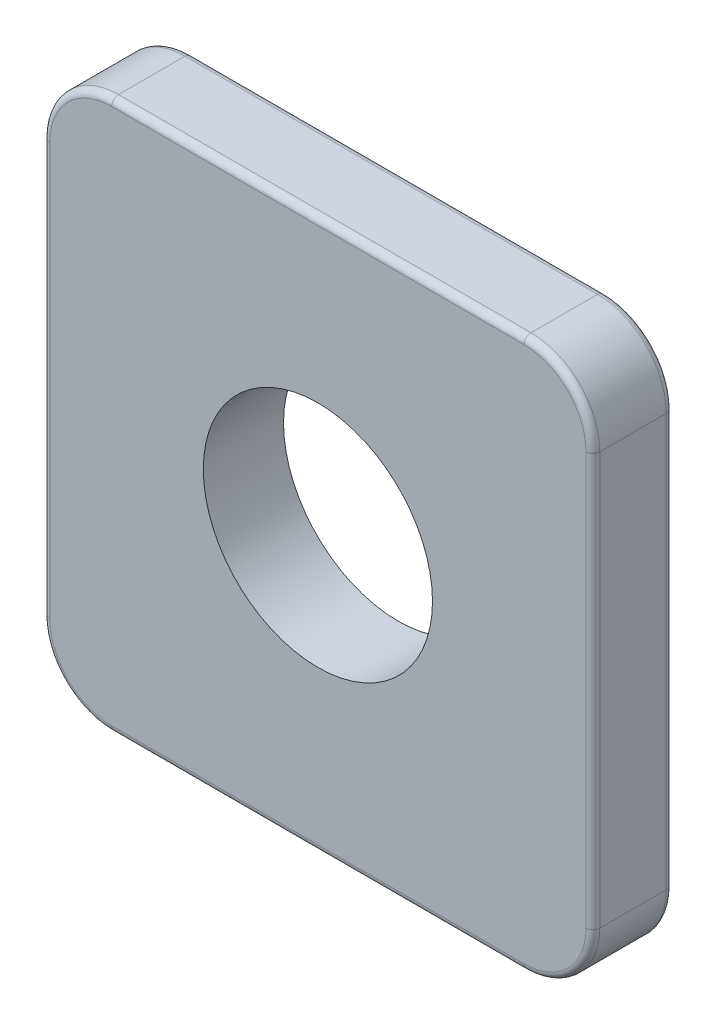
ISO-10303-21;
HEADER;
FILE_DESCRIPTION(('STEP AP214'),'2;1');
FILE_NAME('part.step','',(''),(''),'','','');
FILE_SCHEMA(('AUTOMOTIVE_DESIGN { 1 0 10303 214 1 1 1 1 }'));
ENDSEC;
DATA;
#1=APPLICATION_CONTEXT('core data for automotive mechanical design processes');
#2=APPLICATION_PROTOCOL_DEFINITION('international standard','automotive_design',2000,#1);
#3=PRODUCT_CONTEXT('',#1,'mechanical');
#4=PRODUCT('Part','Part','',(#3));
#5=PRODUCT_RELATED_PRODUCT_CATEGORY('part','',(#4));
#6=PRODUCT_DEFINITION_FORMATION('','',#4);
#7=PRODUCT_DEFINITION_CONTEXT('part definition',#1,'design');
#8=PRODUCT_DEFINITION('design','',#6,#7);
#9=PRODUCT_DEFINITION_SHAPE('','',#8);
#10=(LENGTH_UNIT() NAMED_UNIT(*) SI_UNIT(.MILLI.,.METRE.));
#11=(NAMED_UNIT(*) PLANE_ANGLE_UNIT() SI_UNIT($,.RADIAN.));
#12=(NAMED_UNIT(*) SI_UNIT($,.STERADIAN.) SOLID_ANGLE_UNIT());
#13=UNCERTAINTY_MEASURE_WITH_UNIT(LENGTH_MEASURE(1.E-05),#10,'distance_accuracy_value','');
#14=(GEOMETRIC_REPRESENTATION_CONTEXT(3) GLOBAL_UNCERTAINTY_ASSIGNED_CONTEXT((#13)) GLOBAL_UNIT_ASSIGNED_CONTEXT((#10,
#11,#12)) REPRESENTATION_CONTEXT('',''));
#15=CARTESIAN_POINT('',(0.,0.,0.));
#16=DIRECTION('',(0.,0.,1.));
#17=DIRECTION('',(1.,0.,0.));
#18=AXIS2_PLACEMENT_3D('',#15,#16,#17);
#19=CARTESIAN_POINT('',(9.,-9.,1.75));
#20=DIRECTION('',(0.,0.,1.));
#21=DIRECTION('',(1.,0.,0.));
#22=AXIS2_PLACEMENT_3D('',#19,#20,#21);
#23=PLANE('',#22);
#24=DIRECTION('',(1.,0.,0.));
#25=VECTOR('',#24,1.);
#26=CARTESIAN_POINT('',(8.99999999999998,-11.7,1.75));
#27=LINE('',#26,#25);
#28=CARTESIAN_POINT('',(-8.99999999999998,-11.7,1.75));
#29=VERTEX_POINT('',#28);
#30=CARTESIAN_POINT('',(8.99999999999998,-11.7,1.75));
#31=VERTEX_POINT('',#30);
#32=EDGE_CURVE('E60',#29,#31,#27,.T.);
#33=ORIENTED_EDGE('',*,*,#32,.T.);
#34=CARTESIAN_POINT('',(9.,-9.,1.75));
#35=DIRECTION('',(0.,0.,1.));
#36=DIRECTION('',(1.,0.,0.));
#37=AXIS2_PLACEMENT_3D('',#34,#35,#36);
#38=CIRCLE('',#37,2.7);
#39=CARTESIAN_POINT('',(11.7,-8.99999999999998,1.75));
#40=VERTEX_POINT('',#39);
#41=EDGE_CURVE('E167',#31,#40,#38,.T.);
#42=ORIENTED_EDGE('',*,*,#41,.T.);
#43=DIRECTION('',(0.,1.,0.));
#44=VECTOR('',#43,1.);
#45=CARTESIAN_POINT('',(11.7,8.99999999999998,1.75));
#46=LINE('',#45,#44);
#47=CARTESIAN_POINT('',(11.7,8.99999999999999,1.75));
#48=VERTEX_POINT('',#47);
#49=EDGE_CURVE('E189',#40,#48,#46,.T.);
#50=ORIENTED_EDGE('',*,*,#49,.T.);
#51=CARTESIAN_POINT('',(9.,9.00000000000001,1.75));
#52=DIRECTION('',(0.,0.,1.));
#53=DIRECTION('',(1.,0.,0.));
#54=AXIS2_PLACEMENT_3D('',#51,#52,#53);
#55=CIRCLE('',#54,2.7);
#56=CARTESIAN_POINT('',(8.99999999999998,11.7,1.75));
#57=VERTEX_POINT('',#56);
#58=EDGE_CURVE('E318',#48,#57,#55,.T.);
#59=ORIENTED_EDGE('',*,*,#58,.T.);
#60=DIRECTION('',(-1.,0.,0.));
#61=VECTOR('',#60,1.);
#62=CARTESIAN_POINT('',(-8.99999999999998,11.7,1.75));
#63=LINE('',#62,#61);
#64=CARTESIAN_POINT('',(-8.99999999999998,11.7,1.75));
#65=VERTEX_POINT('',#64);
#66=EDGE_CURVE('E320',#57,#65,#63,.T.);
#67=ORIENTED_EDGE('',*,*,#66,.T.);
#68=CARTESIAN_POINT('',(-9.00000000000001,9.,1.75));
#69=DIRECTION('',(0.,0.,1.));
#70=DIRECTION('',(1.,0.,0.));
#71=AXIS2_PLACEMENT_3D('',#68,#69,#70);
#72=CIRCLE('',#71,2.7);
#73=CARTESIAN_POINT('',(-11.7,8.99999999999998,1.75));
#74=VERTEX_POINT('',#73);
#75=EDGE_CURVE('E322',#65,#74,#72,.T.);
#76=ORIENTED_EDGE('',*,*,#75,.T.);
#77=DIRECTION('',(0.,-1.,0.));
#78=VECTOR('',#77,1.);
#79=CARTESIAN_POINT('',(-11.7,-9.,1.75));
#80=LINE('',#79,#78);
#81=CARTESIAN_POINT('',(-11.7,-9.,1.75));
#82=VERTEX_POINT('',#81);
#83=EDGE_CURVE('E324',#74,#82,#80,.T.);
#84=ORIENTED_EDGE('',*,*,#83,.T.);
#85=CARTESIAN_POINT('',(-9.00000000000001,-9.,1.75));
#86=DIRECTION('',(0.,0.,1.));
#87=DIRECTION('',(1.,0.,0.));
#88=AXIS2_PLACEMENT_3D('',#85,#86,#87);
#89=CIRCLE('',#88,2.7);
#90=EDGE_CURVE('E65',#82,#29,#89,.T.);
#91=ORIENTED_EDGE('',*,*,#90,.T.);
#92=EDGE_LOOP('',(#33,#42,#50,#59,#67,#76,#84,#91));
#93=FACE_BOUND('',#92,.T.);
#94=CARTESIAN_POINT('',(0.,0.,1.75));
#95=DIRECTION('',(0.,0.,1.));
#96=DIRECTION('',(1.,0.,0.));
#97=AXIS2_PLACEMENT_3D('',#94,#95,#96);
#98=CIRCLE('',#97,5.);
#99=CARTESIAN_POINT('',(5.,0.,1.75));
#100=VERTEX_POINT('',#99);
#101=EDGE_CURVE('E250',#100,#100,#98,.T.);
#102=ORIENTED_EDGE('',*,*,#101,.F.);
#103=EDGE_LOOP('',(#102));
#104=FACE_BOUND('',#103,.T.);
#105=ADVANCED_FACE('F43',(#93,#104),#23,.T.);
#106=CARTESIAN_POINT('',(9.,-9.,-1.75));
#107=DIRECTION('',(0.,0.,1.));
#108=DIRECTION('',(1.,0.,0.));
#109=AXIS2_PLACEMENT_3D('',#106,#107,#108);
#110=PLANE('',#109);
#111=DIRECTION('',(0.,1.,0.));
#112=VECTOR('',#111,1.);
#113=CARTESIAN_POINT('',(11.7,-9.,-1.75));
#114=LINE('',#113,#112);
#115=CARTESIAN_POINT('',(11.7,8.99999999999999,-1.75));
#116=VERTEX_POINT('',#115);
#117=CARTESIAN_POINT('',(11.7,-8.99999999999998,-1.75));
#118=VERTEX_POINT('',#117);
#119=EDGE_CURVE('E276',#116,#118,#114,.F.);
#120=ORIENTED_EDGE('',*,*,#119,.T.);
#121=CARTESIAN_POINT('',(9.,-9.,-1.75));
#122=DIRECTION('',(0.,0.,1.));
#123=DIRECTION('',(1.,0.,0.));
#124=AXIS2_PLACEMENT_3D('',#121,#122,#123);
#125=CIRCLE('',#124,2.7);
#126=CARTESIAN_POINT('',(8.99999999999998,-11.7,-1.75));
#127=VERTEX_POINT('',#126);
#128=EDGE_CURVE('E290',#118,#127,#125,.F.);
#129=ORIENTED_EDGE('',*,*,#128,.T.);
#130=DIRECTION('',(1.,0.,0.));
#131=VECTOR('',#130,1.);
#132=CARTESIAN_POINT('',(9.,-11.7,-1.75));
#133=LINE('',#132,#131);
#134=CARTESIAN_POINT('',(-8.99999999999998,-11.7,-1.75));
#135=VERTEX_POINT('',#134);
#136=EDGE_CURVE('E288',#127,#135,#133,.F.);
#137=ORIENTED_EDGE('',*,*,#136,.T.);
#138=CARTESIAN_POINT('',(-9.00000000000001,-9.,-1.75));
#139=DIRECTION('',(0.,0.,1.));
#140=DIRECTION('',(1.,0.,0.));
#141=AXIS2_PLACEMENT_3D('',#138,#139,#140);
#142=CIRCLE('',#141,2.7);
#143=CARTESIAN_POINT('',(-11.7,-9.,-1.75));
#144=VERTEX_POINT('',#143);
#145=EDGE_CURVE('E286',#135,#144,#142,.F.);
#146=ORIENTED_EDGE('',*,*,#145,.T.);
#147=DIRECTION('',(0.,-1.,0.));
#148=VECTOR('',#147,1.);
#149=CARTESIAN_POINT('',(-11.7,-9.,-1.75));
#150=LINE('',#149,#148);
#151=CARTESIAN_POINT('',(-11.7,8.99999999999998,-1.75));
#152=VERTEX_POINT('',#151);
#153=EDGE_CURVE('E284',#144,#152,#150,.F.);
#154=ORIENTED_EDGE('',*,*,#153,.T.);
#155=CARTESIAN_POINT('',(-9.00000000000001,9.,-1.75));
#156=DIRECTION('',(0.,0.,1.));
#157=DIRECTION('',(1.,0.,0.));
#158=AXIS2_PLACEMENT_3D('',#155,#156,#157);
#159=CIRCLE('',#158,2.7);
#160=CARTESIAN_POINT('',(-8.99999999999998,11.7,-1.75));
#161=VERTEX_POINT('',#160);
#162=EDGE_CURVE('E282',#152,#161,#159,.F.);
#163=ORIENTED_EDGE('',*,*,#162,.T.);
#164=DIRECTION('',(-1.,0.,0.));
#165=VECTOR('',#164,1.);
#166=CARTESIAN_POINT('',(8.99999999999999,11.7,-1.75));
#167=LINE('',#166,#165);
#168=CARTESIAN_POINT('',(8.99999999999998,11.7,-1.75));
#169=VERTEX_POINT('',#168);
#170=EDGE_CURVE('E280',#161,#169,#167,.F.);
#171=ORIENTED_EDGE('',*,*,#170,.T.);
#172=CARTESIAN_POINT('',(9.,9.00000000000001,-1.75));
#173=DIRECTION('',(0.,0.,1.));
#174=DIRECTION('',(1.,0.,0.));
#175=AXIS2_PLACEMENT_3D('',#172,#173,#174);
#176=CIRCLE('',#175,2.7);
#177=EDGE_CURVE('E278',#169,#116,#176,.F.);
#178=ORIENTED_EDGE('',*,*,#177,.T.);
#179=EDGE_LOOP('',(#120,#129,#137,#146,#154,#163,#171,#178));
#180=FACE_BOUND('',#179,.T.);
#181=CARTESIAN_POINT('',(0.,0.,-1.75));
#182=DIRECTION('',(0.,0.,1.));
#183=DIRECTION('',(1.,0.,0.));
#184=AXIS2_PLACEMENT_3D('',#181,#182,#183);
#185=CIRCLE('',#184,5.);
#186=CARTESIAN_POINT('',(5.,0.,-1.75));
#187=VERTEX_POINT('',#186);
#188=EDGE_CURVE('E244',#187,#187,#185,.T.);
#189=ORIENTED_EDGE('',*,*,#188,.T.);
#190=EDGE_LOOP('',(#189));
#191=FACE_BOUND('',#190,.T.);
#192=ADVANCED_FACE('F374',(#180,#191),#110,.F.);
#193=CARTESIAN_POINT('',(9.,-9.,1.75));
#194=DIRECTION('',(0.,0.,-1.));
#195=DIRECTION('',(-1.,0.,0.));
#196=AXIS2_PLACEMENT_3D('',#193,#194,#195);
#197=CYLINDRICAL_SURFACE('',#196,3.);
#198=DIRECTION('',(0.,0.,-1.));
#199=VECTOR('',#198,1.);
#200=CARTESIAN_POINT('',(8.99999999999998,-12.,1.75));
#201=LINE('',#200,#199);
#202=CARTESIAN_POINT('',(8.99999999999998,-12.,1.45));
#203=VERTEX_POINT('',#202);
#204=CARTESIAN_POINT('',(8.99999999999998,-12.,-1.45));
#205=VERTEX_POINT('',#204);
#206=EDGE_CURVE('E255',#203,#205,#201,.T.);
#207=ORIENTED_EDGE('',*,*,#206,.T.);
#208=CARTESIAN_POINT('',(9.,-9.,-1.45));
#209=DIRECTION('',(0.,0.,1.));
#210=DIRECTION('',(1.,0.,0.));
#211=AXIS2_PLACEMENT_3D('',#208,#209,#210);
#212=CIRCLE('',#211,3.);
#213=CARTESIAN_POINT('',(12.,-8.99999999999998,-1.45));
#214=VERTEX_POINT('',#213);
#215=EDGE_CURVE('E178',#205,#214,#212,.T.);
#216=ORIENTED_EDGE('',*,*,#215,.T.);
#217=DIRECTION('',(0.,0.,-1.));
#218=VECTOR('',#217,1.);
#219=CARTESIAN_POINT('',(12.,-8.99999999999998,1.75));
#220=LINE('',#219,#218);
#221=CARTESIAN_POINT('',(12.,-8.99999999999998,1.45));
#222=VERTEX_POINT('',#221);
#223=EDGE_CURVE('E160',#222,#214,#220,.T.);
#224=ORIENTED_EDGE('',*,*,#223,.F.);
#225=CARTESIAN_POINT('',(9.,-9.,1.45));
#226=DIRECTION('',(0.,0.,1.));
#227=DIRECTION('',(1.,0.,0.));
#228=AXIS2_PLACEMENT_3D('',#225,#226,#227);
#229=CIRCLE('',#228,3.);
#230=EDGE_CURVE('E175',#222,#203,#229,.F.);
#231=ORIENTED_EDGE('',*,*,#230,.T.);
#232=EDGE_LOOP('',(#207,#216,#224,#231));
#233=FACE_BOUND('',#232,.T.);
#234=ADVANCED_FACE('F174',(#233),#197,.T.);
#235=CARTESIAN_POINT('',(12.,-8.99999999999998,1.75));
#236=DIRECTION('',(-1.,0.,0.));
#237=DIRECTION('',(0.,0.,1.));
#238=AXIS2_PLACEMENT_3D('',#235,#236,#237);
#239=PLANE('',#238);
#240=ORIENTED_EDGE('',*,*,#223,.T.);
#241=DIRECTION('',(0.,1.,0.));
#242=VECTOR('',#241,1.);
#243=CARTESIAN_POINT('',(12.,-8.99999999999998,-1.45));
#244=LINE('',#243,#242);
#245=CARTESIAN_POINT('',(12.,8.99999999999998,-1.45));
#246=VERTEX_POINT('',#245);
#247=EDGE_CURVE('E11',#214,#246,#244,.T.);
#248=ORIENTED_EDGE('',*,*,#247,.T.);
#249=DIRECTION('',(0.,0.,-1.));
#250=VECTOR('',#249,1.);
#251=CARTESIAN_POINT('',(12.,8.99999999999998,1.75));
#252=LINE('',#251,#250);
#253=CARTESIAN_POINT('',(12.,8.99999999999998,1.45));
#254=VERTEX_POINT('',#253);
#255=EDGE_CURVE('E162',#254,#246,#252,.T.);
#256=ORIENTED_EDGE('',*,*,#255,.F.);
#257=DIRECTION('',(0.,1.,0.));
#258=VECTOR('',#257,1.);
#259=CARTESIAN_POINT('',(12.,-8.99999999999998,1.45));
#260=LINE('',#259,#258);
#261=EDGE_CURVE('E52',#254,#222,#260,.F.);
#262=ORIENTED_EDGE('',*,*,#261,.T.);
#263=EDGE_LOOP('',(#240,#248,#256,#262));
#264=FACE_BOUND('',#263,.T.);
#265=ADVANCED_FACE('F159',(#264),#239,.F.);
#266=CARTESIAN_POINT('',(9.,9.00000000000001,1.75));
#267=DIRECTION('',(0.,0.,-1.));
#268=DIRECTION('',(-1.,0.,0.));
#269=AXIS2_PLACEMENT_3D('',#266,#267,#268);
#270=CYLINDRICAL_SURFACE('',#269,3.);
#271=ORIENTED_EDGE('',*,*,#255,.T.);
#272=CARTESIAN_POINT('',(9.,9.00000000000001,-1.45));
#273=DIRECTION('',(0.,0.,1.));
#274=DIRECTION('',(1.,0.,0.));
#275=AXIS2_PLACEMENT_3D('',#272,#273,#274);
#276=CIRCLE('',#275,3.);
#277=CARTESIAN_POINT('',(8.99999999999998,12.,-1.45));
#278=VERTEX_POINT('',#277);
#279=EDGE_CURVE('E315',#246,#278,#276,.T.);
#280=ORIENTED_EDGE('',*,*,#279,.T.);
#281=DIRECTION('',(0.,0.,-1.));
#282=VECTOR('',#281,1.);
#283=CARTESIAN_POINT('',(8.99999999999998,12.,1.75));
#284=LINE('',#283,#282);
#285=CARTESIAN_POINT('',(8.99999999999998,12.,1.45));
#286=VERTEX_POINT('',#285);
#287=EDGE_CURVE('E271',#286,#278,#284,.T.);
#288=ORIENTED_EDGE('',*,*,#287,.F.);
#289=CARTESIAN_POINT('',(9.,9.00000000000001,1.45));
#290=DIRECTION('',(0.,0.,1.));
#291=DIRECTION('',(1.,0.,0.));
#292=AXIS2_PLACEMENT_3D('',#289,#290,#291);
#293=CIRCLE('',#292,3.);
#294=EDGE_CURVE('E313',#286,#254,#293,.F.);
#295=ORIENTED_EDGE('',*,*,#294,.T.);
#296=EDGE_LOOP('',(#271,#280,#288,#295));
#297=FACE_BOUND('',#296,.T.);
#298=ADVANCED_FACE('F400',(#297),#270,.T.);
#299=CARTESIAN_POINT('',(8.99999999999998,12.,1.75));
#300=DIRECTION('',(0.,-1.,0.));
#301=DIRECTION('',(1.,0.,0.));
#302=AXIS2_PLACEMENT_3D('',#299,#300,#301);
#303=PLANE('',#302);
#304=ORIENTED_EDGE('',*,*,#287,.T.);
#305=DIRECTION('',(-1.,0.,0.));
#306=VECTOR('',#305,1.);
#307=CARTESIAN_POINT('',(8.99999999999998,12.,-1.45));
#308=LINE('',#307,#306);
#309=CARTESIAN_POINT('',(-8.99999999999998,12.,-1.45));
#310=VERTEX_POINT('',#309);
#311=EDGE_CURVE('E311',#278,#310,#308,.T.);
#312=ORIENTED_EDGE('',*,*,#311,.T.);
#313=DIRECTION('',(0.,0.,-1.));
#314=VECTOR('',#313,1.);
#315=CARTESIAN_POINT('',(-8.99999999999998,12.,1.75));
#316=LINE('',#315,#314);
#317=CARTESIAN_POINT('',(-8.99999999999998,12.,1.45));
#318=VERTEX_POINT('',#317);
#319=EDGE_CURVE('E268',#318,#310,#316,.T.);
#320=ORIENTED_EDGE('',*,*,#319,.F.);
#321=DIRECTION('',(-1.,0.,0.));
#322=VECTOR('',#321,1.);
#323=CARTESIAN_POINT('',(8.99999999999998,12.,1.45));
#324=LINE('',#323,#322);
#325=EDGE_CURVE('E309',#318,#286,#324,.F.);
#326=ORIENTED_EDGE('',*,*,#325,.T.);
#327=EDGE_LOOP('',(#304,#312,#320,#326));
#328=FACE_BOUND('',#327,.T.);
#329=ADVANCED_FACE('F396',(#328),#303,.F.);
#330=CARTESIAN_POINT('',(-9.00000000000001,9.,1.75));
#331=DIRECTION('',(0.,0.,-1.));
#332=DIRECTION('',(-1.,0.,0.));
#333=AXIS2_PLACEMENT_3D('',#330,#331,#332);
#334=CYLINDRICAL_SURFACE('',#333,3.);
#335=ORIENTED_EDGE('',*,*,#319,.T.);
#336=CARTESIAN_POINT('',(-9.00000000000001,9.,-1.45));
#337=DIRECTION('',(0.,0.,1.));
#338=DIRECTION('',(1.,0.,0.));
#339=AXIS2_PLACEMENT_3D('',#336,#337,#338);
#340=CIRCLE('',#339,3.);
#341=CARTESIAN_POINT('',(-12.,8.99999999999998,-1.45));
#342=VERTEX_POINT('',#341);
#343=EDGE_CURVE('E307',#310,#342,#340,.T.);
#344=ORIENTED_EDGE('',*,*,#343,.T.);
#345=DIRECTION('',(0.,0.,-1.));
#346=VECTOR('',#345,1.);
#347=CARTESIAN_POINT('',(-12.,8.99999999999998,1.75));
#348=LINE('',#347,#346);
#349=CARTESIAN_POINT('',(-12.,8.99999999999998,1.45));
#350=VERTEX_POINT('',#349);
#351=EDGE_CURVE('E265',#350,#342,#348,.T.);
#352=ORIENTED_EDGE('',*,*,#351,.F.);
#353=CARTESIAN_POINT('',(-9.00000000000001,9.,1.45));
#354=DIRECTION('',(0.,0.,1.));
#355=DIRECTION('',(1.,0.,0.));
#356=AXIS2_PLACEMENT_3D('',#353,#354,#355);
#357=CIRCLE('',#356,3.);
#358=EDGE_CURVE('E305',#350,#318,#357,.F.);
#359=ORIENTED_EDGE('',*,*,#358,.T.);
#360=EDGE_LOOP('',(#335,#344,#352,#359));
#361=FACE_BOUND('',#360,.T.);
#362=ADVANCED_FACE('F392',(#361),#334,.T.);
#363=CARTESIAN_POINT('',(-12.,-8.99999999999998,1.75));
#364=DIRECTION('',(1.,0.,0.));
#365=DIRECTION('',(0.,0.,-1.));
#366=AXIS2_PLACEMENT_3D('',#363,#364,#365);
#367=PLANE('',#366);
#368=ORIENTED_EDGE('',*,*,#351,.T.);
#369=DIRECTION('',(0.,-1.,0.));
#370=VECTOR('',#369,1.);
#371=CARTESIAN_POINT('',(-12.,-8.99999999999998,-1.45));
#372=LINE('',#371,#370);
#373=CARTESIAN_POINT('',(-12.,-9.,-1.45));
#374=VERTEX_POINT('',#373);
#375=EDGE_CURVE('E303',#342,#374,#372,.T.);
#376=ORIENTED_EDGE('',*,*,#375,.T.);
#377=DIRECTION('',(0.,0.,-1.));
#378=VECTOR('',#377,1.);
#379=CARTESIAN_POINT('',(-12.,-9.,1.75));
#380=LINE('',#379,#378);
#381=CARTESIAN_POINT('',(-12.,-9.,1.45));
#382=VERTEX_POINT('',#381);
#383=EDGE_CURVE('E262',#382,#374,#380,.T.);
#384=ORIENTED_EDGE('',*,*,#383,.F.);
#385=DIRECTION('',(0.,-1.,0.));
#386=VECTOR('',#385,1.);
#387=CARTESIAN_POINT('',(-12.,8.99999999999998,1.45));
#388=LINE('',#387,#386);
#389=EDGE_CURVE('E301',#382,#350,#388,.F.);
#390=ORIENTED_EDGE('',*,*,#389,.T.);
#391=EDGE_LOOP('',(#368,#376,#384,#390));
#392=FACE_BOUND('',#391,.T.);
#393=ADVANCED_FACE('F389',(#392),#367,.F.);
#394=CARTESIAN_POINT('',(-9.00000000000001,-9.,1.75));
#395=DIRECTION('',(0.,0.,-1.));
#396=DIRECTION('',(-1.,0.,0.));
#397=AXIS2_PLACEMENT_3D('',#394,#395,#396);
#398=CYLINDRICAL_SURFACE('',#397,3.);
#399=ORIENTED_EDGE('',*,*,#383,.T.);
#400=CARTESIAN_POINT('',(-9.00000000000001,-9.,-1.45));
#401=DIRECTION('',(0.,0.,1.));
#402=DIRECTION('',(1.,0.,0.));
#403=AXIS2_PLACEMENT_3D('',#400,#401,#402);
#404=CIRCLE('',#403,3.);
#405=CARTESIAN_POINT('',(-8.99999999999998,-12.,-1.45));
#406=VERTEX_POINT('',#405);
#407=EDGE_CURVE('E299',#374,#406,#404,.T.);
#408=ORIENTED_EDGE('',*,*,#407,.T.);
#409=DIRECTION('',(0.,0.,-1.));
#410=VECTOR('',#409,1.);
#411=CARTESIAN_POINT('',(-8.99999999999998,-12.,1.75));
#412=LINE('',#411,#410);
#413=CARTESIAN_POINT('',(-8.99999999999998,-12.,1.45));
#414=VERTEX_POINT('',#413);
#415=EDGE_CURVE('E259',#414,#406,#412,.T.);
#416=ORIENTED_EDGE('',*,*,#415,.F.);
#417=CARTESIAN_POINT('',(-9.00000000000001,-9.,1.45));
#418=DIRECTION('',(0.,0.,1.));
#419=DIRECTION('',(1.,0.,0.));
#420=AXIS2_PLACEMENT_3D('',#417,#418,#419);
#421=CIRCLE('',#420,3.);
#422=EDGE_CURVE('E297',#414,#382,#421,.F.);
#423=ORIENTED_EDGE('',*,*,#422,.T.);
#424=EDGE_LOOP('',(#399,#408,#416,#423));
#425=FACE_BOUND('',#424,.T.);
#426=ADVANCED_FACE('F350',(#425),#398,.T.);
#427=CARTESIAN_POINT('',(8.99999999999998,-12.,1.75));
#428=DIRECTION('',(0.,1.,0.));
#429=DIRECTION('',(-1.,0.,0.));
#430=AXIS2_PLACEMENT_3D('',#427,#428,#429);
#431=PLANE('',#430);
#432=ORIENTED_EDGE('',*,*,#415,.T.);
#433=DIRECTION('',(1.,0.,0.));
#434=VECTOR('',#433,1.);
#435=CARTESIAN_POINT('',(8.99999999999998,-12.,-1.45));
#436=LINE('',#435,#434);
#437=EDGE_CURVE('E295',#406,#205,#436,.T.);
#438=ORIENTED_EDGE('',*,*,#437,.T.);
#439=ORIENTED_EDGE('',*,*,#206,.F.);
#440=DIRECTION('',(1.,0.,0.));
#441=VECTOR('',#440,1.);
#442=CARTESIAN_POINT('',(-8.99999999999998,-12.,1.45));
#443=LINE('',#442,#441);
#444=EDGE_CURVE('E293',#203,#414,#443,.F.);
#445=ORIENTED_EDGE('',*,*,#444,.T.);
#446=EDGE_LOOP('',(#432,#438,#439,#445));
#447=FACE_BOUND('',#446,.T.);
#448=ADVANCED_FACE('F347',(#447),#431,.F.);
#449=CARTESIAN_POINT('',(0.,0.,1.75));
#450=DIRECTION('',(0.,0.,-1.));
#451=DIRECTION('',(-1.,0.,0.));
#452=AXIS2_PLACEMENT_3D('',#449,#450,#451);
#453=CYLINDRICAL_SURFACE('',#452,5.);
#454=ORIENTED_EDGE('',*,*,#101,.T.);
#455=EDGE_LOOP('',(#454));
#456=FACE_BOUND('',#455,.T.);
#457=ORIENTED_EDGE('',*,*,#188,.F.);
#458=EDGE_LOOP('',(#457));
#459=FACE_BOUND('',#458,.T.);
#460=ADVANCED_FACE('F383',(#456,#459),#453,.F.);
#461=CARTESIAN_POINT('',(-9.00000000000001,9.,-1.45));
#462=DIRECTION('',(0.,0.,1.));
#463=DIRECTION('',(1.,0.,0.));
#464=AXIS2_PLACEMENT_3D('',#461,#462,#463);
#465=TOROIDAL_SURFACE('',#464,2.7,0.3);
#466=CARTESIAN_POINT('',(-8.99999999999998,11.7,-1.45));
#467=DIRECTION('',(1.,0.,0.));
#468=DIRECTION('',(0.,1.,0.));
#469=AXIS2_PLACEMENT_3D('',#466,#467,#468);
#470=CIRCLE('',#469,0.3);
#471=EDGE_CURVE('E237',#161,#310,#470,.T.);
#472=ORIENTED_EDGE('',*,*,#471,.F.);
#473=ORIENTED_EDGE('',*,*,#162,.F.);
#474=CARTESIAN_POINT('',(-11.7,8.99999999999998,-1.45));
#475=DIRECTION('',(0.,-1.,0.));
#476=DIRECTION('',(0.,0.,-1.));
#477=AXIS2_PLACEMENT_3D('',#474,#475,#476);
#478=CIRCLE('',#477,0.3);
#479=EDGE_CURVE('E194',#342,#152,#478,.T.);
#480=ORIENTED_EDGE('',*,*,#479,.F.);
#481=ORIENTED_EDGE('',*,*,#343,.F.);
#482=EDGE_LOOP('',(#472,#473,#480,#481));
#483=FACE_BOUND('',#482,.T.);
#484=ADVANCED_FACE('F443',(#483),#465,.T.);
#485=CARTESIAN_POINT('',(-11.7,-8.99999999999998,-1.45));
#486=DIRECTION('',(0.,-1.,0.));
#487=DIRECTION('',(0.,0.,-1.));
#488=AXIS2_PLACEMENT_3D('',#485,#486,#487);
#489=CYLINDRICAL_SURFACE('',#488,0.3);
#490=ORIENTED_EDGE('',*,*,#479,.T.);
#491=ORIENTED_EDGE('',*,*,#153,.F.);
#492=CARTESIAN_POINT('',(-11.7,-9.,-1.45));
#493=DIRECTION('',(0.,-1.,0.));
#494=DIRECTION('',(0.,0.,-1.));
#495=AXIS2_PLACEMENT_3D('',#492,#493,#494);
#496=CIRCLE('',#495,0.3);
#497=EDGE_CURVE('E235',#374,#144,#496,.T.);
#498=ORIENTED_EDGE('',*,*,#497,.F.);
#499=ORIENTED_EDGE('',*,*,#375,.F.);
#500=EDGE_LOOP('',(#490,#491,#498,#499));
#501=FACE_BOUND('',#500,.T.);
#502=ADVANCED_FACE('F448',(#501),#489,.T.);
#503=CARTESIAN_POINT('',(8.99999999999998,11.7,-1.45));
#504=DIRECTION('',(-1.,0.,0.));
#505=DIRECTION('',(0.,-1.,0.));
#506=AXIS2_PLACEMENT_3D('',#503,#504,#505);
#507=CYLINDRICAL_SURFACE('',#506,0.3);
#508=ORIENTED_EDGE('',*,*,#471,.T.);
#509=ORIENTED_EDGE('',*,*,#311,.F.);
#510=CARTESIAN_POINT('',(8.99999999999998,11.7,-1.45));
#511=DIRECTION('',(1.,0.,0.));
#512=DIRECTION('',(0.,0.,-1.));
#513=AXIS2_PLACEMENT_3D('',#510,#511,#512);
#514=CIRCLE('',#513,0.3);
#515=EDGE_CURVE('E232',#169,#278,#514,.T.);
#516=ORIENTED_EDGE('',*,*,#515,.F.);
#517=ORIENTED_EDGE('',*,*,#170,.F.);
#518=EDGE_LOOP('',(#508,#509,#516,#517));
#519=FACE_BOUND('',#518,.T.);
#520=ADVANCED_FACE('F460',(#519),#507,.T.);
#521=CARTESIAN_POINT('',(-9.00000000000001,-9.,-1.45));
#522=DIRECTION('',(0.,0.,1.));
#523=DIRECTION('',(1.,0.,0.));
#524=AXIS2_PLACEMENT_3D('',#521,#522,#523);
#525=TOROIDAL_SURFACE('',#524,2.7,0.3);
#526=ORIENTED_EDGE('',*,*,#497,.T.);
#527=ORIENTED_EDGE('',*,*,#145,.F.);
#528=CARTESIAN_POINT('',(-8.99999999999998,-11.7,-1.45));
#529=DIRECTION('',(1.,0.,0.));
#530=DIRECTION('',(0.,0.,-1.));
#531=AXIS2_PLACEMENT_3D('',#528,#529,#530);
#532=CIRCLE('',#531,0.3);
#533=EDGE_CURVE('E229',#406,#135,#532,.T.);
#534=ORIENTED_EDGE('',*,*,#533,.F.);
#535=ORIENTED_EDGE('',*,*,#407,.F.);
#536=EDGE_LOOP('',(#526,#527,#534,#535));
#537=FACE_BOUND('',#536,.T.);
#538=ADVANCED_FACE('F355',(#537),#525,.T.);
#539=CARTESIAN_POINT('',(9.,9.00000000000001,-1.45));
#540=DIRECTION('',(0.,0.,1.));
#541=DIRECTION('',(1.,0.,0.));
#542=AXIS2_PLACEMENT_3D('',#539,#540,#541);
#543=TOROIDAL_SURFACE('',#542,2.7,0.3);
#544=ORIENTED_EDGE('',*,*,#515,.T.);
#545=ORIENTED_EDGE('',*,*,#279,.F.);
#546=CARTESIAN_POINT('',(11.7,8.99999999999999,-1.45));
#547=DIRECTION('',(0.,-1.,0.));
#548=DIRECTION('',(1.,0.,0.));
#549=AXIS2_PLACEMENT_3D('',#546,#547,#548);
#550=CIRCLE('',#549,0.3);
#551=EDGE_CURVE('E224',#116,#246,#550,.T.);
#552=ORIENTED_EDGE('',*,*,#551,.F.);
#553=ORIENTED_EDGE('',*,*,#177,.F.);
#554=EDGE_LOOP('',(#544,#545,#552,#553));
#555=FACE_BOUND('',#554,.T.);
#556=ADVANCED_FACE('F479',(#555),#543,.T.);
#557=CARTESIAN_POINT('',(8.99999999999998,-11.7,-1.45));
#558=DIRECTION('',(1.,0.,0.));
#559=DIRECTION('',(0.,1.,0.));
#560=AXIS2_PLACEMENT_3D('',#557,#558,#559);
#561=CYLINDRICAL_SURFACE('',#560,0.3);
#562=ORIENTED_EDGE('',*,*,#533,.T.);
#563=ORIENTED_EDGE('',*,*,#136,.F.);
#564=CARTESIAN_POINT('',(8.99999999999998,-11.7,-1.45));
#565=DIRECTION('',(1.,0.,0.));
#566=DIRECTION('',(0.,0.,-1.));
#567=AXIS2_PLACEMENT_3D('',#564,#565,#566);
#568=CIRCLE('',#567,0.3);
#569=EDGE_CURVE('E218',#205,#127,#568,.T.);
#570=ORIENTED_EDGE('',*,*,#569,.F.);
#571=ORIENTED_EDGE('',*,*,#437,.F.);
#572=EDGE_LOOP('',(#562,#563,#570,#571));
#573=FACE_BOUND('',#572,.T.);
#574=ADVANCED_FACE('F361',(#573),#561,.T.);
#575=CARTESIAN_POINT('',(11.7,-8.99999999999998,-1.45));
#576=DIRECTION('',(0.,1.,0.));
#577=DIRECTION('',(0.,0.,1.));
#578=AXIS2_PLACEMENT_3D('',#575,#576,#577);
#579=CYLINDRICAL_SURFACE('',#578,0.3);
#580=ORIENTED_EDGE('',*,*,#551,.T.);
#581=ORIENTED_EDGE('',*,*,#247,.F.);
#582=CARTESIAN_POINT('',(11.7,-8.99999999999998,-1.45));
#583=DIRECTION('',(0.,-1.,0.));
#584=DIRECTION('',(1.,0.,0.));
#585=AXIS2_PLACEMENT_3D('',#582,#583,#584);
#586=CIRCLE('',#585,0.3);
#587=EDGE_CURVE('E213',#118,#214,#586,.T.);
#588=ORIENTED_EDGE('',*,*,#587,.F.);
#589=ORIENTED_EDGE('',*,*,#119,.F.);
#590=EDGE_LOOP('',(#580,#581,#588,#589));
#591=FACE_BOUND('',#590,.T.);
#592=ADVANCED_FACE('F364',(#591),#579,.T.);
#593=CARTESIAN_POINT('',(9.,-9.,-1.45));
#594=DIRECTION('',(0.,0.,1.));
#595=DIRECTION('',(1.,0.,0.));
#596=AXIS2_PLACEMENT_3D('',#593,#594,#595);
#597=TOROIDAL_SURFACE('',#596,2.7,0.3);
#598=ORIENTED_EDGE('',*,*,#569,.T.);
#599=ORIENTED_EDGE('',*,*,#128,.F.);
#600=ORIENTED_EDGE('',*,*,#587,.T.);
#601=ORIENTED_EDGE('',*,*,#215,.F.);
#602=EDGE_LOOP('',(#598,#599,#600,#601));
#603=FACE_BOUND('',#602,.T.);
#604=ADVANCED_FACE('F362',(#603),#597,.T.);
#605=CARTESIAN_POINT('',(-9.00000000000001,9.,1.45));
#606=DIRECTION('',(0.,0.,1.));
#607=DIRECTION('',(1.,0.,0.));
#608=AXIS2_PLACEMENT_3D('',#605,#606,#607);
#609=TOROIDAL_SURFACE('',#608,2.7,0.3);
#610=CARTESIAN_POINT('',(-8.99999999999998,11.7,1.45));
#611=DIRECTION('',(1.,0.,0.));
#612=DIRECTION('',(0.,1.,0.));
#613=AXIS2_PLACEMENT_3D('',#610,#611,#612);
#614=CIRCLE('',#613,0.3);
#615=EDGE_CURVE('E206',#318,#65,#614,.T.);
#616=ORIENTED_EDGE('',*,*,#615,.F.);
#617=ORIENTED_EDGE('',*,*,#358,.F.);
#618=CARTESIAN_POINT('',(-11.7,8.99999999999998,1.45));
#619=DIRECTION('',(0.,-1.,0.));
#620=DIRECTION('',(0.,0.,-1.));
#621=AXIS2_PLACEMENT_3D('',#618,#619,#620);
#622=CIRCLE('',#621,0.3);
#623=EDGE_CURVE('E47',#74,#350,#622,.T.);
#624=ORIENTED_EDGE('',*,*,#623,.F.);
#625=ORIENTED_EDGE('',*,*,#75,.F.);
#626=EDGE_LOOP('',(#616,#617,#624,#625));
#627=FACE_BOUND('',#626,.T.);
#628=ADVANCED_FACE('F45',(#627),#609,.T.);
#629=CARTESIAN_POINT('',(-11.7,-9.,1.45));
#630=DIRECTION('',(0.,1.,0.));
#631=DIRECTION('',(0.,0.,1.));
#632=AXIS2_PLACEMENT_3D('',#629,#630,#631);
#633=CYLINDRICAL_SURFACE('',#632,0.3);
#634=ORIENTED_EDGE('',*,*,#623,.T.);
#635=ORIENTED_EDGE('',*,*,#389,.F.);
#636=CARTESIAN_POINT('',(-11.7,-9.,1.45));
#637=DIRECTION('',(0.,-1.,0.));
#638=DIRECTION('',(0.,0.,-1.));
#639=AXIS2_PLACEMENT_3D('',#636,#637,#638);
#640=CIRCLE('',#639,0.3);
#641=EDGE_CURVE('E204',#82,#382,#640,.T.);
#642=ORIENTED_EDGE('',*,*,#641,.F.);
#643=ORIENTED_EDGE('',*,*,#83,.F.);
#644=EDGE_LOOP('',(#634,#635,#642,#643));
#645=FACE_BOUND('',#644,.T.);
#646=ADVANCED_FACE('F339',(#645),#633,.T.);
#647=CARTESIAN_POINT('',(8.99999999999999,11.7,1.45));
#648=DIRECTION('',(1.,0.,0.));
#649=DIRECTION('',(0.,1.,0.));
#650=AXIS2_PLACEMENT_3D('',#647,#648,#649);
#651=CYLINDRICAL_SURFACE('',#650,0.3);
#652=ORIENTED_EDGE('',*,*,#615,.T.);
#653=ORIENTED_EDGE('',*,*,#66,.F.);
#654=CARTESIAN_POINT('',(8.99999999999998,11.7,1.45));
#655=DIRECTION('',(1.,0.,0.));
#656=DIRECTION('',(0.,0.,-1.));
#657=AXIS2_PLACEMENT_3D('',#654,#655,#656);
#658=CIRCLE('',#657,0.3);
#659=EDGE_CURVE('E201',#286,#57,#658,.T.);
#660=ORIENTED_EDGE('',*,*,#659,.F.);
#661=ORIENTED_EDGE('',*,*,#325,.F.);
#662=EDGE_LOOP('',(#652,#653,#660,#661));
#663=FACE_BOUND('',#662,.T.);
#664=ADVANCED_FACE('F334',(#663),#651,.T.);
#665=CARTESIAN_POINT('',(-9.00000000000001,-9.,1.45));
#666=DIRECTION('',(0.,0.,1.));
#667=DIRECTION('',(1.,0.,0.));
#668=AXIS2_PLACEMENT_3D('',#665,#666,#667);
#669=TOROIDAL_SURFACE('',#668,2.7,0.3);
#670=ORIENTED_EDGE('',*,*,#641,.T.);
#671=ORIENTED_EDGE('',*,*,#422,.F.);
#672=CARTESIAN_POINT('',(-8.99999999999998,-11.7,1.45));
#673=DIRECTION('',(1.,0.,0.));
#674=DIRECTION('',(0.,0.,-1.));
#675=AXIS2_PLACEMENT_3D('',#672,#673,#674);
#676=CIRCLE('',#675,0.3);
#677=EDGE_CURVE('E198',#29,#414,#676,.T.);
#678=ORIENTED_EDGE('',*,*,#677,.F.);
#679=ORIENTED_EDGE('',*,*,#90,.F.);
#680=EDGE_LOOP('',(#670,#671,#678,#679));
#681=FACE_BOUND('',#680,.T.);
#682=ADVANCED_FACE('F342',(#681),#669,.T.);
#683=CARTESIAN_POINT('',(9.,9.00000000000001,1.45));
#684=DIRECTION('',(0.,0.,1.));
#685=DIRECTION('',(1.,0.,0.));
#686=AXIS2_PLACEMENT_3D('',#683,#684,#685);
#687=TOROIDAL_SURFACE('',#686,2.7,0.3);
#688=ORIENTED_EDGE('',*,*,#659,.T.);
#689=ORIENTED_EDGE('',*,*,#58,.F.);
#690=CARTESIAN_POINT('',(11.7,8.99999999999999,1.45));
#691=DIRECTION('',(0.,-1.,0.));
#692=DIRECTION('',(1.,0.,0.));
#693=AXIS2_PLACEMENT_3D('',#690,#691,#692);
#694=CIRCLE('',#693,0.3);
#695=EDGE_CURVE('E191',#254,#48,#694,.T.);
#696=ORIENTED_EDGE('',*,*,#695,.F.);
#697=ORIENTED_EDGE('',*,*,#294,.F.);
#698=EDGE_LOOP('',(#688,#689,#696,#697));
#699=FACE_BOUND('',#698,.T.);
#700=ADVANCED_FACE('F331',(#699),#687,.T.);
#701=CARTESIAN_POINT('',(9.,-11.7,1.45));
#702=DIRECTION('',(-1.,0.,0.));
#703=DIRECTION('',(0.,-1.,0.));
#704=AXIS2_PLACEMENT_3D('',#701,#702,#703);
#705=CYLINDRICAL_SURFACE('',#704,0.3);
#706=ORIENTED_EDGE('',*,*,#677,.T.);
#707=ORIENTED_EDGE('',*,*,#444,.F.);
#708=CARTESIAN_POINT('',(8.99999999999998,-11.7,1.45));
#709=DIRECTION('',(1.,0.,0.));
#710=DIRECTION('',(0.,1.,0.));
#711=AXIS2_PLACEMENT_3D('',#708,#709,#710);
#712=CIRCLE('',#711,0.3);
#713=EDGE_CURVE('E185',#31,#203,#712,.T.);
#714=ORIENTED_EDGE('',*,*,#713,.F.);
#715=ORIENTED_EDGE('',*,*,#32,.F.);
#716=EDGE_LOOP('',(#706,#707,#714,#715));
#717=FACE_BOUND('',#716,.T.);
#718=ADVANCED_FACE('F344',(#717),#705,.T.);
#719=CARTESIAN_POINT('',(11.7,-9.,1.45));
#720=DIRECTION('',(0.,-1.,0.));
#721=DIRECTION('',(0.,0.,-1.));
#722=AXIS2_PLACEMENT_3D('',#719,#720,#721);
#723=CYLINDRICAL_SURFACE('',#722,0.3);
#724=ORIENTED_EDGE('',*,*,#695,.T.);
#725=ORIENTED_EDGE('',*,*,#49,.F.);
#726=CARTESIAN_POINT('',(11.7,-8.99999999999998,1.45));
#727=DIRECTION('',(0.,-1.,0.));
#728=DIRECTION('',(0.,0.,-1.));
#729=AXIS2_PLACEMENT_3D('',#726,#727,#728);
#730=CIRCLE('',#729,0.3);
#731=EDGE_CURVE('E183',#222,#40,#730,.T.);
#732=ORIENTED_EDGE('',*,*,#731,.F.);
#733=ORIENTED_EDGE('',*,*,#261,.F.);
#734=EDGE_LOOP('',(#724,#725,#732,#733));
#735=FACE_BOUND('',#734,.T.);
#736=ADVANCED_FACE('F188',(#735),#723,.T.);
#737=CARTESIAN_POINT('',(9.,-9.,1.45));
#738=DIRECTION('',(0.,0.,1.));
#739=DIRECTION('',(1.,0.,0.));
#740=AXIS2_PLACEMENT_3D('',#737,#738,#739);
#741=TOROIDAL_SURFACE('',#740,2.7,0.3);
#742=ORIENTED_EDGE('',*,*,#713,.T.);
#743=ORIENTED_EDGE('',*,*,#230,.F.);
#744=ORIENTED_EDGE('',*,*,#731,.T.);
#745=ORIENTED_EDGE('',*,*,#41,.F.);
#746=EDGE_LOOP('',(#742,#743,#744,#745));
#747=FACE_BOUND('',#746,.T.);
#748=ADVANCED_FACE('F181',(#747),#741,.T.);
#749=CLOSED_SHELL('',(#105,#192,#234,#265,#298,#329,#362,#393,#426,#448,#460,#484,#502,#520,
#538,#556,#574,#592,#604,#628,#646,#664,#682,#700,#718,#736,#748));
#750=MANIFOLD_SOLID_BREP('B2',#749);
#751=ADVANCED_BREP_SHAPE_REPRESENTATION('',(#18,#750),#14);
#752=SHAPE_DEFINITION_REPRESENTATION(#9,#751);
ENDSEC;
END-ISO-10303-21;
